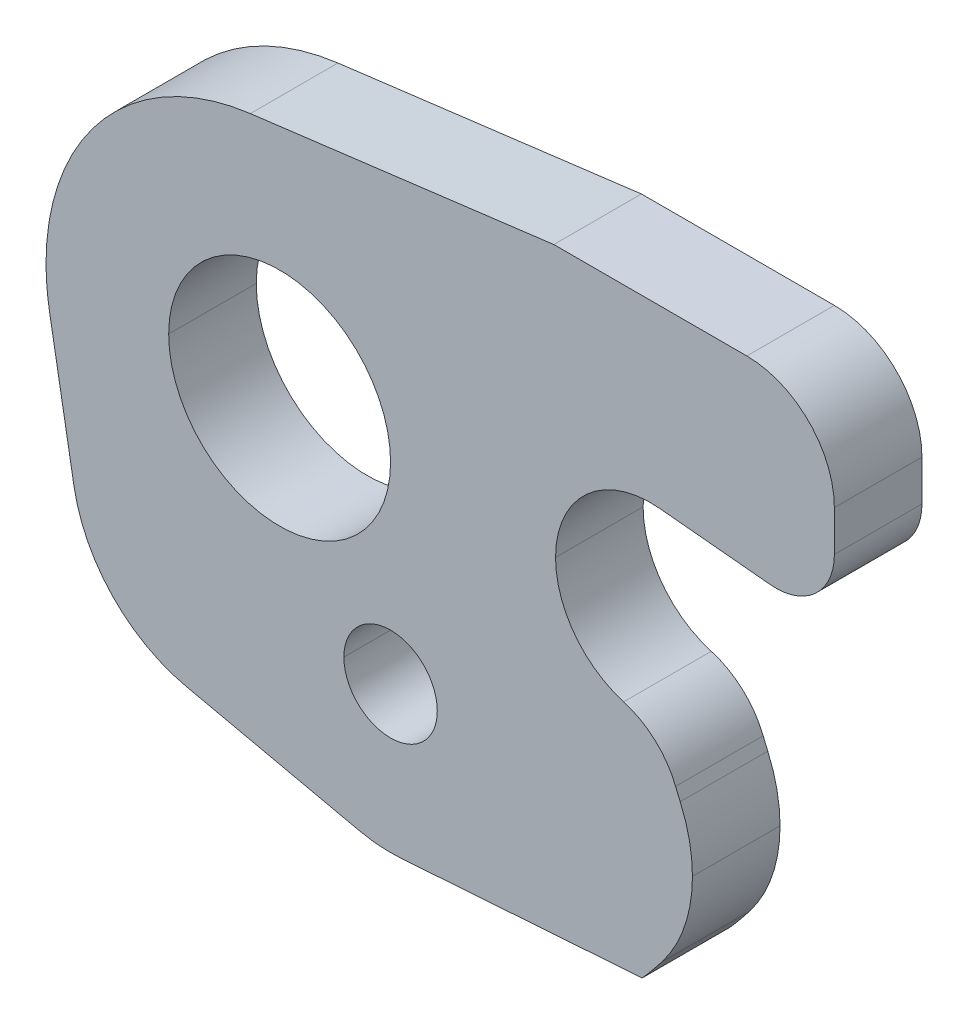
ISO-10303-21;
HEADER;
FILE_DESCRIPTION(('STEP AP214'),'2;1');
FILE_NAME('part.step','',(''),(''),'','','');
FILE_SCHEMA(('AUTOMOTIVE_DESIGN { 1 0 10303 214 1 1 1 1 }'));
ENDSEC;
DATA;
#1=APPLICATION_CONTEXT('core data for automotive mechanical design processes');
#2=APPLICATION_PROTOCOL_DEFINITION('international standard','automotive_design',2000,#1);
#3=PRODUCT_CONTEXT('',#1,'mechanical');
#4=PRODUCT('Part','Part','',(#3));
#5=PRODUCT_RELATED_PRODUCT_CATEGORY('part','',(#4));
#6=PRODUCT_DEFINITION_FORMATION('','',#4);
#7=PRODUCT_DEFINITION_CONTEXT('part definition',#1,'design');
#8=PRODUCT_DEFINITION('design','',#6,#7);
#9=PRODUCT_DEFINITION_SHAPE('','',#8);
#10=(LENGTH_UNIT() NAMED_UNIT(*) SI_UNIT(.MILLI.,.METRE.));
#11=(NAMED_UNIT(*) PLANE_ANGLE_UNIT() SI_UNIT($,.RADIAN.));
#12=(NAMED_UNIT(*) SI_UNIT($,.STERADIAN.) SOLID_ANGLE_UNIT());
#13=UNCERTAINTY_MEASURE_WITH_UNIT(LENGTH_MEASURE(1.E-05),#10,'distance_accuracy_value','');
#14=(GEOMETRIC_REPRESENTATION_CONTEXT(3) GLOBAL_UNCERTAINTY_ASSIGNED_CONTEXT((#13)) GLOBAL_UNIT_ASSIGNED_CONTEXT((#10,
#11,#12)) REPRESENTATION_CONTEXT('',''));
#15=CARTESIAN_POINT('',(0.,0.,0.));
#16=DIRECTION('',(0.,0.,1.));
#17=DIRECTION('',(1.,0.,0.));
#18=AXIS2_PLACEMENT_3D('',#15,#16,#17);
#19=CARTESIAN_POINT('',(-3.56093370082958,-7.1164973952939,-4.));
#20=DIRECTION('',(0.,0.,1.));
#21=DIRECTION('',(1.,0.,0.));
#22=AXIS2_PLACEMENT_3D('',#19,#20,#21);
#23=CYLINDRICAL_SURFACE('',#22,5.);
#24=CARTESIAN_POINT('',(-3.56093370082958,-7.1164973952939,-7.));
#25=DIRECTION('',(0.,0.,-1.));
#26=DIRECTION('',(1.,0.,0.));
#27=AXIS2_PLACEMENT_3D('',#24,#25,#26);
#28=CIRCLE('',#27,5.);
#29=CARTESIAN_POINT('',(1.43906629917042,-7.1164973952939,-7.));
#30=VERTEX_POINT('',#29);
#31=CARTESIAN_POINT('',(0.38408319641119,-10.1884416787217,-7.));
#32=VERTEX_POINT('',#31);
#33=EDGE_CURVE('E42',#30,#32,#28,.T.);
#34=ORIENTED_EDGE('',*,*,#33,.F.);
#35=DIRECTION('',(0.,0.,1.));
#36=VECTOR('',#35,1.);
#37=CARTESIAN_POINT('',(1.43906629917042,-7.1164973952939,-4.));
#38=LINE('',#37,#36);
#39=CARTESIAN_POINT('',(1.43906629917042,-7.1164973952939,-4.));
#40=VERTEX_POINT('',#39);
#41=EDGE_CURVE('E11',#30,#40,#38,.T.);
#42=ORIENTED_EDGE('',*,*,#41,.T.);
#43=CARTESIAN_POINT('',(-3.56093370082958,-7.1164973952939,-4.));
#44=DIRECTION('',(0.,0.,1.));
#45=DIRECTION('',(1.,0.,0.));
#46=AXIS2_PLACEMENT_3D('',#43,#44,#45);
#47=CIRCLE('',#46,5.);
#48=CARTESIAN_POINT('',(0.38408319641119,-10.1884416787217,-4.));
#49=VERTEX_POINT('',#48);
#50=EDGE_CURVE('E258',#49,#40,#47,.T.);
#51=ORIENTED_EDGE('',*,*,#50,.F.);
#52=DIRECTION('',(0.,0.,1.));
#53=VECTOR('',#52,1.);
#54=CARTESIAN_POINT('',(0.384083196411191,-10.1884416787217,-4.));
#55=LINE('',#54,#53);
#56=EDGE_CURVE('E421',#32,#49,#55,.T.);
#57=ORIENTED_EDGE('',*,*,#56,.F.);
#58=EDGE_LOOP('',(#34,#42,#51,#57));
#59=FACE_BOUND('',#58,.T.);
#60=ADVANCED_FACE('F17',(#59),#23,.T.);
#61=CARTESIAN_POINT('',(-12.7,0.,-4.));
#62=DIRECTION('',(0.,0.,-1.));
#63=DIRECTION('',(-1.,0.,0.));
#64=AXIS2_PLACEMENT_3D('',#61,#62,#63);
#65=CYLINDRICAL_SURFACE('',#64,3.8);
#66=CARTESIAN_POINT('',(-12.7,0.,-4.));
#67=DIRECTION('',(0.,0.,1.));
#68=DIRECTION('',(1.,0.,0.));
#69=AXIS2_PLACEMENT_3D('',#66,#67,#68);
#70=CIRCLE('',#69,3.8);
#71=CARTESIAN_POINT('',(-16.5,0.,-4.));
#72=VERTEX_POINT('',#71);
#73=CARTESIAN_POINT('',(-8.9,0.,-4.));
#74=VERTEX_POINT('',#73);
#75=EDGE_CURVE('E28',#72,#74,#70,.T.);
#76=ORIENTED_EDGE('',*,*,#75,.T.);
#77=DIRECTION('',(0.,0.,-1.));
#78=VECTOR('',#77,1.);
#79=CARTESIAN_POINT('',(-8.9,0.,-4.));
#80=LINE('',#79,#78);
#81=CARTESIAN_POINT('',(-8.9,0.,-7.));
#82=VERTEX_POINT('',#81);
#83=EDGE_CURVE('E277',#74,#82,#80,.T.);
#84=ORIENTED_EDGE('',*,*,#83,.T.);
#85=CARTESIAN_POINT('',(-12.7,0.,-7.));
#86=DIRECTION('',(0.,0.,1.));
#87=DIRECTION('',(1.,0.,0.));
#88=AXIS2_PLACEMENT_3D('',#85,#86,#87);
#89=CIRCLE('',#88,3.8);
#90=CARTESIAN_POINT('',(-16.5,0.,-7.));
#91=VERTEX_POINT('',#90);
#92=EDGE_CURVE('E237',#91,#82,#89,.T.);
#93=ORIENTED_EDGE('',*,*,#92,.F.);
#94=DIRECTION('',(0.,0.,-1.));
#95=VECTOR('',#94,1.);
#96=CARTESIAN_POINT('',(-16.5,0.,-4.));
#97=LINE('',#96,#95);
#98=EDGE_CURVE('E333',#72,#91,#97,.T.);
#99=ORIENTED_EDGE('',*,*,#98,.F.);
#100=EDGE_LOOP('',(#76,#84,#93,#99));
#101=FACE_BOUND('',#100,.T.);
#102=ADVANCED_FACE('F896',(#101),#65,.F.);
#103=CARTESIAN_POINT('',(-8.9,-6.58179306876173,-4.));
#104=DIRECTION('',(0.,0.,-1.));
#105=DIRECTION('',(-1.,0.,0.));
#106=AXIS2_PLACEMENT_3D('',#103,#104,#105);
#107=CYLINDRICAL_SURFACE('',#106,1.6);
#108=CARTESIAN_POINT('',(-8.9,-6.58179306876173,-4.));
#109=DIRECTION('',(0.,0.,-1.));
#110=DIRECTION('',(-1.,0.,0.));
#111=AXIS2_PLACEMENT_3D('',#108,#109,#110);
#112=CIRCLE('',#111,1.6);
#113=CARTESIAN_POINT('',(-7.3,-6.58179306876173,-4.));
#114=VERTEX_POINT('',#113);
#115=CARTESIAN_POINT('',(-10.5,-6.58179306876173,-4.));
#116=VERTEX_POINT('',#115);
#117=EDGE_CURVE('E385',#114,#116,#112,.T.);
#118=ORIENTED_EDGE('',*,*,#117,.F.);
#119=DIRECTION('',(0.,0.,-1.));
#120=VECTOR('',#119,1.);
#121=CARTESIAN_POINT('',(-7.3,-6.58179306876173,-4.));
#122=LINE('',#121,#120);
#123=CARTESIAN_POINT('',(-7.3,-6.58179306876173,-7.));
#124=VERTEX_POINT('',#123);
#125=EDGE_CURVE('E302',#114,#124,#122,.T.);
#126=ORIENTED_EDGE('',*,*,#125,.T.);
#127=CARTESIAN_POINT('',(-8.9,-6.58179306876173,-7.));
#128=DIRECTION('',(0.,0.,-1.));
#129=DIRECTION('',(-1.,0.,0.));
#130=AXIS2_PLACEMENT_3D('',#127,#128,#129);
#131=CIRCLE('',#130,1.6);
#132=CARTESIAN_POINT('',(-10.5,-6.58179306876173,-7.));
#133=VERTEX_POINT('',#132);
#134=EDGE_CURVE('E298',#124,#133,#131,.T.);
#135=ORIENTED_EDGE('',*,*,#134,.T.);
#136=DIRECTION('',(0.,0.,-1.));
#137=VECTOR('',#136,1.);
#138=CARTESIAN_POINT('',(-10.5,-6.58179306876173,-4.));
#139=LINE('',#138,#137);
#140=EDGE_CURVE('E247',#116,#133,#139,.T.);
#141=ORIENTED_EDGE('',*,*,#140,.F.);
#142=EDGE_LOOP('',(#118,#126,#135,#141));
#143=FACE_BOUND('',#142,.T.);
#144=ADVANCED_FACE('F891',(#143),#107,.F.);
#145=CARTESIAN_POINT('',(-12.7,0.,-4.));
#146=DIRECTION('',(0.,0.,-1.));
#147=DIRECTION('',(-1.,0.,0.));
#148=AXIS2_PLACEMENT_3D('',#145,#146,#147);
#149=CYLINDRICAL_SURFACE('',#148,8.);
#150=CARTESIAN_POINT('',(-12.7,0.,-4.));
#151=DIRECTION('',(0.,0.,1.));
#152=DIRECTION('',(1.,0.,0.));
#153=AXIS2_PLACEMENT_3D('',#150,#151,#152);
#154=CIRCLE('',#153,8.);
#155=CARTESIAN_POINT('',(-20.7,0.,-4.));
#156=VERTEX_POINT('',#155);
#157=CARTESIAN_POINT('',(-20.5784620240977,-1.38918542133544,-4.));
#158=VERTEX_POINT('',#157);
#159=EDGE_CURVE('E214',#156,#158,#154,.T.);
#160=ORIENTED_EDGE('',*,*,#159,.F.);
#161=DIRECTION('',(0.,0.,-1.));
#162=VECTOR('',#161,1.);
#163=CARTESIAN_POINT('',(-20.7,0.,-4.));
#164=LINE('',#163,#162);
#165=CARTESIAN_POINT('',(-20.7,0.,-7.));
#166=VERTEX_POINT('',#165);
#167=EDGE_CURVE('E303',#156,#166,#164,.T.);
#168=ORIENTED_EDGE('',*,*,#167,.T.);
#169=CARTESIAN_POINT('',(-12.7,0.,-7.));
#170=DIRECTION('',(0.,0.,1.));
#171=DIRECTION('',(1.,0.,0.));
#172=AXIS2_PLACEMENT_3D('',#169,#170,#171);
#173=CIRCLE('',#172,8.);
#174=CARTESIAN_POINT('',(-20.5784620240977,-1.38918542133544,-7.));
#175=VERTEX_POINT('',#174);
#176=EDGE_CURVE('E293',#166,#175,#173,.T.);
#177=ORIENTED_EDGE('',*,*,#176,.T.);
#178=DIRECTION('',(0.,0.,-1.));
#179=VECTOR('',#178,1.);
#180=CARTESIAN_POINT('',(-20.5784620240977,-1.38918542133544,-4.));
#181=LINE('',#180,#179);
#182=EDGE_CURVE('E218',#158,#175,#181,.T.);
#183=ORIENTED_EDGE('',*,*,#182,.F.);
#184=EDGE_LOOP('',(#160,#168,#177,#183));
#185=FACE_BOUND('',#184,.T.);
#186=ADVANCED_FACE('F506',(#185),#149,.T.);
#187=CARTESIAN_POINT('',(0.,0.,-4.));
#188=DIRECTION('',(0.,0.,-1.));
#189=DIRECTION('',(-1.,0.,0.));
#190=AXIS2_PLACEMENT_3D('',#187,#188,#189);
#191=CYLINDRICAL_SURFACE('',#190,3.25);
#192=CARTESIAN_POINT('',(0.,0.,-4.));
#193=DIRECTION('',(0.,0.,-1.));
#194=DIRECTION('',(1.,0.,0.));
#195=AXIS2_PLACEMENT_3D('',#192,#193,#194);
#196=CIRCLE('',#195,3.25);
#197=CARTESIAN_POINT('',(-3.25,0.,-4.));
#198=VERTEX_POINT('',#197);
#199=CARTESIAN_POINT('',(0.31149869569072,3.23503764469334,-4.));
#200=VERTEX_POINT('',#199);
#201=EDGE_CURVE('E379',#198,#200,#196,.T.);
#202=ORIENTED_EDGE('',*,*,#201,.F.);
#203=DIRECTION('',(0.,0.,-1.));
#204=VECTOR('',#203,1.);
#205=CARTESIAN_POINT('',(-3.25,0.,-4.));
#206=LINE('',#205,#204);
#207=CARTESIAN_POINT('',(-3.25,0.,-7.));
#208=VERTEX_POINT('',#207);
#209=EDGE_CURVE('E289',#198,#208,#206,.T.);
#210=ORIENTED_EDGE('',*,*,#209,.T.);
#211=CARTESIAN_POINT('',(0.,0.,-7.));
#212=DIRECTION('',(0.,0.,-1.));
#213=DIRECTION('',(1.,0.,0.));
#214=AXIS2_PLACEMENT_3D('',#211,#212,#213);
#215=CIRCLE('',#214,3.25);
#216=CARTESIAN_POINT('',(0.31149869569072,3.23503764469334,-7.));
#217=VERTEX_POINT('',#216);
#218=EDGE_CURVE('E294',#208,#217,#215,.T.);
#219=ORIENTED_EDGE('',*,*,#218,.T.);
#220=DIRECTION('',(0.,0.,-1.));
#221=VECTOR('',#220,1.);
#222=CARTESIAN_POINT('',(0.31149869569072,3.23503764469334,-4.));
#223=LINE('',#222,#221);
#224=EDGE_CURVE('E311',#200,#217,#223,.T.);
#225=ORIENTED_EDGE('',*,*,#224,.F.);
#226=EDGE_LOOP('',(#202,#210,#219,#225));
#227=FACE_BOUND('',#226,.T.);
#228=ADVANCED_FACE('F521',(#227),#191,.F.);
#229=CARTESIAN_POINT('',(-19.6504258269461,-9.32134344670185,-4.));
#230=DIRECTION('',(0.216439613938103,0.976296007119933,0.));
#231=DIRECTION('',(0.,0.,-1.));
#232=AXIS2_PLACEMENT_3D('',#229,#230,#231);
#233=PLANE('',#232);
#234=DIRECTION('',(0.976296007119934,-0.216439613938103,0.));
#235=VECTOR('',#234,1.);
#236=CARTESIAN_POINT('',(-19.6504258269461,-9.32134344670185,-4.));
#237=LINE('',#236,#235);
#238=CARTESIAN_POINT('',(-15.8989626856317,-10.153022802233,-4.));
#239=VERTEX_POINT('',#238);
#240=CARTESIAN_POINT('',(-9.98250760235053,-11.4646693159631,-4.));
#241=VERTEX_POINT('',#240);
#242=EDGE_CURVE('E328',#239,#241,#237,.T.);
#243=ORIENTED_EDGE('',*,*,#242,.F.);
#244=DIRECTION('',(0.,0.,-1.));
#245=VECTOR('',#244,1.);
#246=CARTESIAN_POINT('',(-15.8989626856317,-10.153022802233,-4.));
#247=LINE('',#246,#245);
#248=CARTESIAN_POINT('',(-15.8989626856317,-10.153022802233,-7.));
#249=VERTEX_POINT('',#248);
#250=EDGE_CURVE('E307',#239,#249,#247,.T.);
#251=ORIENTED_EDGE('',*,*,#250,.T.);
#252=DIRECTION('',(0.976296007119934,-0.216439613938103,0.));
#253=VECTOR('',#252,1.);
#254=CARTESIAN_POINT('',(-19.6504258269461,-9.32134344670185,-7.));
#255=LINE('',#254,#253);
#256=CARTESIAN_POINT('',(-9.98250760235053,-11.4646693159631,-7.));
#257=VERTEX_POINT('',#256);
#258=EDGE_CURVE('E397',#249,#257,#255,.T.);
#259=ORIENTED_EDGE('',*,*,#258,.T.);
#260=DIRECTION('',(0.,0.,-1.));
#261=VECTOR('',#260,1.);
#262=CARTESIAN_POINT('',(-9.98250760235053,-11.4646693159631,-4.));
#263=LINE('',#262,#261);
#264=EDGE_CURVE('E272',#241,#257,#263,.T.);
#265=ORIENTED_EDGE('',*,*,#264,.F.);
#266=EDGE_LOOP('',(#243,#251,#259,#265));
#267=FACE_BOUND('',#266,.T.);
#268=ADVANCED_FACE('F781',(#267),#233,.F.);
#269=CARTESIAN_POINT('',(-8.9,-6.58179306876173,-4.));
#270=DIRECTION('',(0.,0.,-1.));
#271=DIRECTION('',(-1.,0.,0.));
#272=AXIS2_PLACEMENT_3D('',#269,#270,#271);
#273=CYLINDRICAL_SURFACE('',#272,5.00143011094306);
#274=CARTESIAN_POINT('',(-8.9,-6.58179306876173,-7.));
#275=DIRECTION('',(0.,0.,1.));
#276=DIRECTION('',(1.,0.,0.));
#277=AXIS2_PLACEMENT_3D('',#274,#275,#276);
#278=CIRCLE('',#277,5.00143011094306);
#279=CARTESIAN_POINT('',(-8.55111787178275,-11.5710399473255,-7.));
#280=VERTEX_POINT('',#279);
#281=EDGE_CURVE('E288',#257,#280,#278,.T.);
#282=ORIENTED_EDGE('',*,*,#281,.T.);
#283=DIRECTION('',(0.,0.,-1.));
#284=VECTOR('',#283,1.);
#285=CARTESIAN_POINT('',(-8.55111787178275,-11.5710399473255,-4.));
#286=LINE('',#285,#284);
#287=CARTESIAN_POINT('',(-8.55111787178275,-11.5710399473255,-4.));
#288=VERTEX_POINT('',#287);
#289=EDGE_CURVE('E273',#288,#280,#286,.T.);
#290=ORIENTED_EDGE('',*,*,#289,.F.);
#291=CARTESIAN_POINT('',(-8.9,-6.58179306876173,-4.));
#292=DIRECTION('',(0.,0.,1.));
#293=DIRECTION('',(1.,0.,0.));
#294=AXIS2_PLACEMENT_3D('',#291,#292,#293);
#295=CIRCLE('',#294,5.00143011094306);
#296=EDGE_CURVE('E418',#241,#288,#295,.T.);
#297=ORIENTED_EDGE('',*,*,#296,.F.);
#298=ORIENTED_EDGE('',*,*,#264,.T.);
#299=EDGE_LOOP('',(#282,#290,#297,#298));
#300=FACE_BOUND('',#299,.T.);
#301=ADVANCED_FACE('F448',(#300),#273,.T.);
#302=CARTESIAN_POINT('',(-8.55111787178291,-11.5710399473255,-4.));
#303=DIRECTION('',(-0.0697564737441258,0.997564050259824,0.));
#304=DIRECTION('',(0.,0.,1.));
#305=AXIS2_PLACEMENT_3D('',#302,#303,#304);
#306=PLANE('',#305);
#307=DIRECTION('',(0.997564050259824,0.0697564737441258,0.));
#308=VECTOR('',#307,1.);
#309=CARTESIAN_POINT('',(-8.55111787178291,-11.5710399473255,-7.));
#310=LINE('',#309,#308);
#311=CARTESIAN_POINT('',(-0.28418705475944,-10.9929598307335,-7.));
#312=VERTEX_POINT('',#311);
#313=EDGE_CURVE('E268',#280,#312,#310,.T.);
#314=ORIENTED_EDGE('',*,*,#313,.T.);
#315=DIRECTION('',(0.,0.,-1.));
#316=VECTOR('',#315,1.);
#317=CARTESIAN_POINT('',(-0.28418705475944,-10.9929598307335,-4.));
#318=LINE('',#317,#316);
#319=CARTESIAN_POINT('',(-0.28418705475944,-10.9929598307335,-4.));
#320=VERTEX_POINT('',#319);
#321=EDGE_CURVE('E21',#320,#312,#318,.T.);
#322=ORIENTED_EDGE('',*,*,#321,.F.);
#323=DIRECTION('',(0.997564050259824,0.0697564737441258,0.));
#324=VECTOR('',#323,1.);
#325=CARTESIAN_POINT('',(-8.55111787178291,-11.5710399473255,-4.));
#326=LINE('',#325,#324);
#327=EDGE_CURVE('E257',#288,#320,#326,.T.);
#328=ORIENTED_EDGE('',*,*,#327,.F.);
#329=ORIENTED_EDGE('',*,*,#289,.T.);
#330=EDGE_LOOP('',(#314,#322,#328,#329));
#331=FACE_BOUND('',#330,.T.);
#332=ADVANCED_FACE('F459',(#331),#306,.F.);
#333=CARTESIAN_POINT('',(-12.7,0.,-4.));
#334=DIRECTION('',(0.,0.,-1.));
#335=DIRECTION('',(-1.,0.,0.));
#336=AXIS2_PLACEMENT_3D('',#333,#334,#335);
#337=CYLINDRICAL_SURFACE('',#336,16.5830508933466);
#338=CARTESIAN_POINT('',(-12.7,0.,-7.));
#339=DIRECTION('',(0.,0.,1.));
#340=DIRECTION('',(1.,0.,0.));
#341=AXIS2_PLACEMENT_3D('',#338,#339,#340);
#342=CIRCLE('',#341,16.5830508933466);
#343=EDGE_CURVE('E321',#312,#32,#342,.T.);
#344=ORIENTED_EDGE('',*,*,#343,.T.);
#345=ORIENTED_EDGE('',*,*,#56,.T.);
#346=CARTESIAN_POINT('',(-12.7,0.,-4.));
#347=DIRECTION('',(0.,0.,1.));
#348=DIRECTION('',(1.,0.,0.));
#349=AXIS2_PLACEMENT_3D('',#346,#347,#348);
#350=CIRCLE('',#349,16.5830508933466);
#351=EDGE_CURVE('E253',#320,#49,#350,.T.);
#352=ORIENTED_EDGE('',*,*,#351,.F.);
#353=ORIENTED_EDGE('',*,*,#321,.T.);
#354=EDGE_LOOP('',(#344,#345,#352,#353));
#355=FACE_BOUND('',#354,.T.);
#356=ADVANCED_FACE('F810',(#355),#337,.T.);
#357=CARTESIAN_POINT('',(12.7,0.,-4.));
#358=DIRECTION('',(0.,0.,-1.));
#359=DIRECTION('',(-1.,0.,0.));
#360=AXIS2_PLACEMENT_3D('',#357,#358,#359);
#361=CYLINDRICAL_SURFACE('',#360,12.75);
#362=CARTESIAN_POINT('',(12.7,0.,-4.));
#363=DIRECTION('',(0.,0.,-1.));
#364=DIRECTION('',(1.,0.,0.));
#365=AXIS2_PLACEMENT_3D('',#362,#363,#364);
#366=CIRCLE('',#365,12.75);
#367=CARTESIAN_POINT('',(1.01961100362946,-5.11185024168999,-4.));
#368=VERTEX_POINT('',#367);
#369=CARTESIAN_POINT('',(0.861964628213943,-4.73533721463981,-4.));
#370=VERTEX_POINT('',#369);
#371=EDGE_CURVE('E220',#368,#370,#366,.T.);
#372=ORIENTED_EDGE('',*,*,#371,.F.);
#373=DIRECTION('',(0.,0.,-1.));
#374=VECTOR('',#373,1.);
#375=CARTESIAN_POINT('',(1.01961100362946,-5.11185024168999,-4.));
#376=LINE('',#375,#374);
#377=CARTESIAN_POINT('',(1.01961100362946,-5.11185024168999,-7.));
#378=VERTEX_POINT('',#377);
#379=EDGE_CURVE('E437',#368,#378,#376,.T.);
#380=ORIENTED_EDGE('',*,*,#379,.T.);
#381=CARTESIAN_POINT('',(12.7,0.,-7.));
#382=DIRECTION('',(0.,0.,-1.));
#383=DIRECTION('',(1.,0.,0.));
#384=AXIS2_PLACEMENT_3D('',#381,#382,#383);
#385=CIRCLE('',#384,12.75);
#386=CARTESIAN_POINT('',(0.861964628213943,-4.73533721463981,-7.));
#387=VERTEX_POINT('',#386);
#388=EDGE_CURVE('E242',#378,#387,#385,.T.);
#389=ORIENTED_EDGE('',*,*,#388,.T.);
#390=DIRECTION('',(0.,0.,-1.));
#391=VECTOR('',#390,1.);
#392=CARTESIAN_POINT('',(0.861964628213943,-4.73533721463981,-4.));
#393=LINE('',#392,#391);
#394=EDGE_CURVE('E243',#370,#387,#393,.T.);
#395=ORIENTED_EDGE('',*,*,#394,.F.);
#396=EDGE_LOOP('',(#372,#380,#389,#395));
#397=FACE_BOUND('',#396,.T.);
#398=ADVANCED_FACE('F882',(#397),#361,.F.);
#399=CARTESIAN_POINT('',(-1.69133858267716,-5.75668079701729,-4.));
#400=DIRECTION('',(0.,0.,-1.));
#401=DIRECTION('',(-1.,0.,0.));
#402=AXIS2_PLACEMENT_3D('',#399,#400,#401);
#403=CYLINDRICAL_SURFACE('',#402,2.75);
#404=CARTESIAN_POINT('',(-1.69133858267716,-5.75668079701729,-7.));
#405=DIRECTION('',(0.,0.,1.));
#406=DIRECTION('',(1.,0.,0.));
#407=AXIS2_PLACEMENT_3D('',#404,#405,#406);
#408=CIRCLE('',#407,2.75);
#409=CARTESIAN_POINT('',(-0.916141732283465,-3.11820209838436,-7.));
#410=VERTEX_POINT('',#409);
#411=EDGE_CURVE('E238',#387,#410,#408,.T.);
#412=ORIENTED_EDGE('',*,*,#411,.T.);
#413=DIRECTION('',(0.,0.,-1.));
#414=VECTOR('',#413,1.);
#415=CARTESIAN_POINT('',(-0.916141732283465,-3.11820209838436,-4.));
#416=LINE('',#415,#414);
#417=CARTESIAN_POINT('',(-0.916141732283465,-3.11820209838436,-4.));
#418=VERTEX_POINT('',#417);
#419=EDGE_CURVE('E264',#418,#410,#416,.T.);
#420=ORIENTED_EDGE('',*,*,#419,.F.);
#421=CARTESIAN_POINT('',(-1.69133858267716,-5.75668079701729,-4.));
#422=DIRECTION('',(0.,0.,1.));
#423=DIRECTION('',(1.,0.,0.));
#424=AXIS2_PLACEMENT_3D('',#421,#422,#423);
#425=CIRCLE('',#424,2.75);
#426=EDGE_CURVE('E225',#370,#418,#425,.T.);
#427=ORIENTED_EDGE('',*,*,#426,.F.);
#428=ORIENTED_EDGE('',*,*,#394,.T.);
#429=EDGE_LOOP('',(#412,#420,#427,#428));
#430=FACE_BOUND('',#429,.T.);
#431=ADVANCED_FACE('F876',(#430),#403,.T.);
#432=CARTESIAN_POINT('',(0.,0.,-4.));
#433=DIRECTION('',(0.,0.,-1.));
#434=DIRECTION('',(-1.,0.,0.));
#435=AXIS2_PLACEMENT_3D('',#432,#433,#434);
#436=CYLINDRICAL_SURFACE('',#435,3.25);
#437=ORIENTED_EDGE('',*,*,#209,.F.);
#438=CARTESIAN_POINT('',(0.,0.,-4.));
#439=DIRECTION('',(0.,0.,-1.));
#440=DIRECTION('',(1.,0.,0.));
#441=AXIS2_PLACEMENT_3D('',#438,#439,#440);
#442=CIRCLE('',#441,3.25);
#443=EDGE_CURVE('E285',#418,#198,#442,.T.);
#444=ORIENTED_EDGE('',*,*,#443,.F.);
#445=ORIENTED_EDGE('',*,*,#419,.T.);
#446=CARTESIAN_POINT('',(0.,0.,-7.));
#447=DIRECTION('',(0.,0.,-1.));
#448=DIRECTION('',(1.,0.,0.));
#449=AXIS2_PLACEMENT_3D('',#446,#447,#448);
#450=CIRCLE('',#449,3.25);
#451=EDGE_CURVE('E376',#410,#208,#450,.T.);
#452=ORIENTED_EDGE('',*,*,#451,.T.);
#453=EDGE_LOOP('',(#437,#444,#445,#452));
#454=FACE_BOUND('',#453,.T.);
#455=ADVANCED_FACE('F881',(#454),#436,.F.);
#456=CARTESIAN_POINT('',(0.31149869569072,3.23503764469334,-4.));
#457=DIRECTION('',(0.0958457525202244,0.995396198367179,0.));
#458=DIRECTION('',(0.,0.,-1.));
#459=AXIS2_PLACEMENT_3D('',#456,#457,#458);
#460=PLANE('',#459);
#461=DIRECTION('',(0.995396198367179,-0.0958457525202244,0.));
#462=VECTOR('',#461,1.);
#463=CARTESIAN_POINT('',(0.31149869569072,3.23503764469334,-7.));
#464=LINE('',#463,#462);
#465=CARTESIAN_POINT('',(4.10830849495955,2.86944644293465,-7.));
#466=VERTEX_POINT('',#465);
#467=EDGE_CURVE('E314',#217,#466,#464,.T.);
#468=ORIENTED_EDGE('',*,*,#467,.T.);
#469=DIRECTION('',(0.,0.,-1.));
#470=VECTOR('',#469,1.);
#471=CARTESIAN_POINT('',(4.10830849495955,2.86944644293465,-4.));
#472=LINE('',#471,#470);
#473=CARTESIAN_POINT('',(4.10830849495955,2.86944644293465,-4.));
#474=VERTEX_POINT('',#473);
#475=EDGE_CURVE('E403',#474,#466,#472,.T.);
#476=ORIENTED_EDGE('',*,*,#475,.F.);
#477=DIRECTION('',(0.995396198367179,-0.0958457525202244,0.));
#478=VECTOR('',#477,1.);
#479=CARTESIAN_POINT('',(0.31149869569072,3.23503764469334,-4.));
#480=LINE('',#479,#478);
#481=EDGE_CURVE('E246',#200,#474,#480,.T.);
#482=ORIENTED_EDGE('',*,*,#481,.F.);
#483=ORIENTED_EDGE('',*,*,#224,.T.);
#484=EDGE_LOOP('',(#468,#476,#482,#483));
#485=FACE_BOUND('',#484,.T.);
#486=ADVANCED_FACE('F519',(#485),#460,.F.);
#487=CARTESIAN_POINT('',(4.3,4.86023883966901,-4.));
#488=DIRECTION('',(0.,0.,-1.));
#489=DIRECTION('',(-1.,0.,0.));
#490=AXIS2_PLACEMENT_3D('',#487,#488,#489);
#491=CYLINDRICAL_SURFACE('',#490,2.);
#492=CARTESIAN_POINT('',(4.3,4.86023883966901,-7.));
#493=DIRECTION('',(0.,0.,1.));
#494=DIRECTION('',(1.,0.,0.));
#495=AXIS2_PLACEMENT_3D('',#492,#493,#494);
#496=CIRCLE('',#495,2.);
#497=CARTESIAN_POINT('',(6.3,4.86023883966901,-7.));
#498=VERTEX_POINT('',#497);
#499=EDGE_CURVE('E315',#466,#498,#496,.T.);
#500=ORIENTED_EDGE('',*,*,#499,.T.);
#501=DIRECTION('',(0.,0.,-1.));
#502=VECTOR('',#501,1.);
#503=CARTESIAN_POINT('',(6.3,4.86023883966901,-4.));
#504=LINE('',#503,#502);
#505=CARTESIAN_POINT('',(6.3,4.86023883966901,-4.));
#506=VERTEX_POINT('',#505);
#507=EDGE_CURVE('E353',#506,#498,#504,.T.);
#508=ORIENTED_EDGE('',*,*,#507,.F.);
#509=CARTESIAN_POINT('',(4.3,4.86023883966901,-4.));
#510=DIRECTION('',(0.,0.,1.));
#511=DIRECTION('',(1.,0.,0.));
#512=AXIS2_PLACEMENT_3D('',#509,#510,#511);
#513=CIRCLE('',#512,2.);
#514=EDGE_CURVE('E232',#474,#506,#513,.T.);
#515=ORIENTED_EDGE('',*,*,#514,.F.);
#516=ORIENTED_EDGE('',*,*,#475,.T.);
#517=EDGE_LOOP('',(#500,#508,#515,#516));
#518=FACE_BOUND('',#517,.T.);
#519=ADVANCED_FACE('F512',(#518),#491,.T.);
#520=CARTESIAN_POINT('',(6.3,4.86023883966901,-4.));
#521=DIRECTION('',(-1.,0.,0.));
#522=DIRECTION('',(0.,0.,1.));
#523=AXIS2_PLACEMENT_3D('',#520,#521,#522);
#524=PLANE('',#523);
#525=DIRECTION('',(0.,1.,0.));
#526=VECTOR('',#525,1.);
#527=CARTESIAN_POINT('',(6.3,4.86023883966901,-7.));
#528=LINE('',#527,#526);
#529=CARTESIAN_POINT('',(6.3,6.25,-7.));
#530=VERTEX_POINT('',#529);
#531=EDGE_CURVE('E360',#498,#530,#528,.T.);
#532=ORIENTED_EDGE('',*,*,#531,.T.);
#533=DIRECTION('',(0.,0.,-1.));
#534=VECTOR('',#533,1.);
#535=CARTESIAN_POINT('',(6.3,6.25,-4.));
#536=LINE('',#535,#534);
#537=CARTESIAN_POINT('',(6.3,6.25,-4.));
#538=VERTEX_POINT('',#537);
#539=EDGE_CURVE('E318',#538,#530,#536,.T.);
#540=ORIENTED_EDGE('',*,*,#539,.F.);
#541=DIRECTION('',(0.,1.,0.));
#542=VECTOR('',#541,1.);
#543=CARTESIAN_POINT('',(6.3,4.86023883966901,-4.));
#544=LINE('',#543,#542);
#545=EDGE_CURVE('E229',#506,#538,#544,.T.);
#546=ORIENTED_EDGE('',*,*,#545,.F.);
#547=ORIENTED_EDGE('',*,*,#507,.T.);
#548=EDGE_LOOP('',(#532,#540,#546,#547));
#549=FACE_BOUND('',#548,.T.);
#550=ADVANCED_FACE('F514',(#549),#524,.F.);
#551=CARTESIAN_POINT('',(3.3,6.25,-4.));
#552=DIRECTION('',(0.,0.,-1.));
#553=DIRECTION('',(-1.,0.,0.));
#554=AXIS2_PLACEMENT_3D('',#551,#552,#553);
#555=CYLINDRICAL_SURFACE('',#554,3.);
#556=CARTESIAN_POINT('',(3.3,6.25,-7.));
#557=DIRECTION('',(0.,0.,1.));
#558=DIRECTION('',(1.,0.,0.));
#559=AXIS2_PLACEMENT_3D('',#556,#557,#558);
#560=CIRCLE('',#559,3.);
#561=CARTESIAN_POINT('',(3.3,9.25,-7.));
#562=VERTEX_POINT('',#561);
#563=EDGE_CURVE('E350',#530,#562,#560,.T.);
#564=ORIENTED_EDGE('',*,*,#563,.T.);
#565=DIRECTION('',(0.,0.,-1.));
#566=VECTOR('',#565,1.);
#567=CARTESIAN_POINT('',(3.3,9.25,-4.));
#568=LINE('',#567,#566);
#569=CARTESIAN_POINT('',(3.3,9.25,-4.));
#570=VERTEX_POINT('',#569);
#571=EDGE_CURVE('E226',#570,#562,#568,.T.);
#572=ORIENTED_EDGE('',*,*,#571,.F.);
#573=CARTESIAN_POINT('',(3.3,6.25,-4.));
#574=DIRECTION('',(0.,0.,1.));
#575=DIRECTION('',(1.,0.,0.));
#576=AXIS2_PLACEMENT_3D('',#573,#574,#575);
#577=CIRCLE('',#576,3.);
#578=EDGE_CURVE('E191',#538,#570,#577,.T.);
#579=ORIENTED_EDGE('',*,*,#578,.F.);
#580=ORIENTED_EDGE('',*,*,#539,.T.);
#581=EDGE_LOOP('',(#564,#572,#579,#580));
#582=FACE_BOUND('',#581,.T.);
#583=ADVANCED_FACE('F769',(#582),#555,.T.);
#584=CARTESIAN_POINT('',(3.3,9.25,-4.));
#585=DIRECTION('',(0.,-1.,0.));
#586=DIRECTION('',(-1.,0.,0.));
#587=AXIS2_PLACEMENT_3D('',#584,#585,#586);
#588=PLANE('',#587);
#589=DIRECTION('',(-1.,0.,0.));
#590=VECTOR('',#589,1.);
#591=CARTESIAN_POINT('',(3.3,9.25,-7.));
#592=LINE('',#591,#590);
#593=CARTESIAN_POINT('',(-3.30854847764693,9.25,-7.));
#594=VERTEX_POINT('',#593);
#595=EDGE_CURVE('E199',#562,#594,#592,.T.);
#596=ORIENTED_EDGE('',*,*,#595,.T.);
#597=DIRECTION('',(0.,0.,-1.));
#598=VECTOR('',#597,1.);
#599=CARTESIAN_POINT('',(-3.30854847764693,9.25,-4.));
#600=LINE('',#599,#598);
#601=CARTESIAN_POINT('',(-3.30854847764693,9.25,-4.));
#602=VERTEX_POINT('',#601);
#603=EDGE_CURVE('E170',#602,#594,#600,.T.);
#604=ORIENTED_EDGE('',*,*,#603,.F.);
#605=DIRECTION('',(-1.,0.,0.));
#606=VECTOR('',#605,1.);
#607=CARTESIAN_POINT('',(3.3,9.25,-4.));
#608=LINE('',#607,#606);
#609=EDGE_CURVE('E182',#570,#602,#608,.T.);
#610=ORIENTED_EDGE('',*,*,#609,.F.);
#611=ORIENTED_EDGE('',*,*,#571,.T.);
#612=EDGE_LOOP('',(#596,#604,#610,#611));
#613=FACE_BOUND('',#612,.T.);
#614=ADVANCED_FACE('F197',(#613),#588,.F.);
#615=CARTESIAN_POINT('',(-3.30854847764693,9.25,-4.));
#616=DIRECTION('',(0.125333233564304,-0.992114701314478,0.));
#617=DIRECTION('',(0.,0.,-1.));
#618=AXIS2_PLACEMENT_3D('',#615,#616,#617);
#619=PLANE('',#618);
#620=DIRECTION('',(-0.992114701314478,-0.125333233564304,0.));
#621=VECTOR('',#620,1.);
#622=CARTESIAN_POINT('',(-3.30854847764693,9.25,-7.));
#623=LINE('',#622,#621);
#624=CARTESIAN_POINT('',(-13.7026658685144,7.93691761051582,-7.));
#625=VERTEX_POINT('',#624);
#626=EDGE_CURVE('E202',#594,#625,#623,.T.);
#627=ORIENTED_EDGE('',*,*,#626,.T.);
#628=DIRECTION('',(0.,0.,-1.));
#629=VECTOR('',#628,1.);
#630=CARTESIAN_POINT('',(-13.7026658685144,7.93691761051582,-4.));
#631=LINE('',#630,#629);
#632=CARTESIAN_POINT('',(-13.7026658685144,7.93691761051582,-4.));
#633=VERTEX_POINT('',#632);
#634=EDGE_CURVE('E203',#633,#625,#631,.T.);
#635=ORIENTED_EDGE('',*,*,#634,.F.);
#636=DIRECTION('',(-0.992114701314478,-0.125333233564304,0.));
#637=VECTOR('',#636,1.);
#638=CARTESIAN_POINT('',(-3.30854847764693,9.25,-4.));
#639=LINE('',#638,#637);
#640=EDGE_CURVE('E187',#602,#633,#639,.T.);
#641=ORIENTED_EDGE('',*,*,#640,.F.);
#642=ORIENTED_EDGE('',*,*,#603,.T.);
#643=EDGE_LOOP('',(#627,#635,#641,#642));
#644=FACE_BOUND('',#643,.T.);
#645=ADVANCED_FACE('F205',(#644),#619,.F.);
#646=CARTESIAN_POINT('',(-12.7,0.,-4.));
#647=DIRECTION('',(0.,0.,-1.));
#648=DIRECTION('',(-1.,0.,0.));
#649=AXIS2_PLACEMENT_3D('',#646,#647,#648);
#650=CYLINDRICAL_SURFACE('',#649,8.);
#651=ORIENTED_EDGE('',*,*,#167,.F.);
#652=CARTESIAN_POINT('',(-12.7,0.,-4.));
#653=DIRECTION('',(0.,0.,1.));
#654=DIRECTION('',(1.,0.,0.));
#655=AXIS2_PLACEMENT_3D('',#652,#653,#654);
#656=CIRCLE('',#655,8.);
#657=EDGE_CURVE('E208',#633,#156,#656,.T.);
#658=ORIENTED_EDGE('',*,*,#657,.F.);
#659=ORIENTED_EDGE('',*,*,#634,.T.);
#660=CARTESIAN_POINT('',(-12.7,0.,-7.));
#661=DIRECTION('',(0.,0.,1.));
#662=DIRECTION('',(1.,0.,0.));
#663=AXIS2_PLACEMENT_3D('',#660,#661,#662);
#664=CIRCLE('',#663,8.);
#665=EDGE_CURVE('E251',#625,#166,#664,.T.);
#666=ORIENTED_EDGE('',*,*,#665,.T.);
#667=EDGE_LOOP('',(#651,#658,#659,#666));
#668=FACE_BOUND('',#667,.T.);
#669=ADVANCED_FACE('F508',(#668),#650,.T.);
#670=CARTESIAN_POINT('',(-8.9,-6.58179306876173,-4.));
#671=DIRECTION('',(0.,0.,-1.));
#672=DIRECTION('',(-1.,0.,0.));
#673=AXIS2_PLACEMENT_3D('',#670,#671,#672);
#674=CYLINDRICAL_SURFACE('',#673,1.6);
#675=ORIENTED_EDGE('',*,*,#125,.F.);
#676=CARTESIAN_POINT('',(-8.9,-6.58179306876173,-4.));
#677=DIRECTION('',(0.,0.,-1.));
#678=DIRECTION('',(-1.,0.,0.));
#679=AXIS2_PLACEMENT_3D('',#676,#677,#678);
#680=CIRCLE('',#679,1.6);
#681=EDGE_CURVE('E430',#116,#114,#680,.T.);
#682=ORIENTED_EDGE('',*,*,#681,.F.);
#683=ORIENTED_EDGE('',*,*,#140,.T.);
#684=CARTESIAN_POINT('',(-8.9,-6.58179306876173,-7.));
#685=DIRECTION('',(0.,0.,-1.));
#686=DIRECTION('',(-1.,0.,0.));
#687=AXIS2_PLACEMENT_3D('',#684,#685,#686);
#688=CIRCLE('',#687,1.6);
#689=EDGE_CURVE('E252',#133,#124,#688,.T.);
#690=ORIENTED_EDGE('',*,*,#689,.T.);
#691=EDGE_LOOP('',(#675,#682,#683,#690));
#692=FACE_BOUND('',#691,.T.);
#693=ADVANCED_FACE('F822',(#692),#674,.F.);
#694=CARTESIAN_POINT('',(-20.5784620240977,-1.38918542133544,-4.));
#695=DIRECTION('',(0.984807753012208,0.17364817766693,0.));
#696=DIRECTION('',(0.,0.,-1.));
#697=AXIS2_PLACEMENT_3D('',#694,#695,#696);
#698=PLANE('',#697);
#699=DIRECTION('',(0.17364817766693,-0.984807753012208,0.));
#700=VECTOR('',#699,1.);
#701=CARTESIAN_POINT('',(-20.5784620240977,-1.38918542133544,-7.));
#702=LINE('',#701,#700);
#703=CARTESIAN_POINT('',(-19.7408033810023,-6.13978365496794,-7.));
#704=VERTEX_POINT('',#703);
#705=EDGE_CURVE('E338',#175,#704,#702,.T.);
#706=ORIENTED_EDGE('',*,*,#705,.T.);
#707=DIRECTION('',(0.,0.,1.));
#708=VECTOR('',#707,1.);
#709=CARTESIAN_POINT('',(-19.7408033810023,-6.13978365496794,-4.));
#710=LINE('',#709,#708);
#711=CARTESIAN_POINT('',(-19.7408033810023,-6.13978365496794,-4.));
#712=VERTEX_POINT('',#711);
#713=EDGE_CURVE('E342',#704,#712,#710,.T.);
#714=ORIENTED_EDGE('',*,*,#713,.T.);
#715=DIRECTION('',(0.17364817766693,-0.984807753012208,0.));
#716=VECTOR('',#715,1.);
#717=CARTESIAN_POINT('',(-20.5784620240977,-1.38918542133544,-4.));
#718=LINE('',#717,#716);
#719=EDGE_CURVE('E327',#158,#712,#718,.T.);
#720=ORIENTED_EDGE('',*,*,#719,.F.);
#721=ORIENTED_EDGE('',*,*,#182,.T.);
#722=EDGE_LOOP('',(#706,#714,#720,#721));
#723=FACE_BOUND('',#722,.T.);
#724=ADVANCED_FACE('F817',(#723),#698,.F.);
#725=CARTESIAN_POINT('',(-12.7,0.,-4.));
#726=DIRECTION('',(0.,0.,-1.));
#727=DIRECTION('',(-1.,0.,0.));
#728=AXIS2_PLACEMENT_3D('',#725,#726,#727);
#729=CYLINDRICAL_SURFACE('',#728,3.8);
#730=ORIENTED_EDGE('',*,*,#83,.F.);
#731=CARTESIAN_POINT('',(-12.7,0.,-4.));
#732=DIRECTION('',(0.,0.,1.));
#733=DIRECTION('',(1.,0.,0.));
#734=AXIS2_PLACEMENT_3D('',#731,#732,#733);
#735=CIRCLE('',#734,3.8);
#736=EDGE_CURVE('E329',#74,#72,#735,.T.);
#737=ORIENTED_EDGE('',*,*,#736,.T.);
#738=ORIENTED_EDGE('',*,*,#98,.T.);
#739=CARTESIAN_POINT('',(-12.7,0.,-7.));
#740=DIRECTION('',(0.,0.,1.));
#741=DIRECTION('',(1.,0.,0.));
#742=AXIS2_PLACEMENT_3D('',#739,#740,#741);
#743=CIRCLE('',#742,3.8);
#744=EDGE_CURVE('E233',#82,#91,#743,.T.);
#745=ORIENTED_EDGE('',*,*,#744,.F.);
#746=EDGE_LOOP('',(#730,#737,#738,#745));
#747=FACE_BOUND('',#746,.T.);
#748=ADVANCED_FACE('F798',(#747),#729,.F.);
#749=CARTESIAN_POINT('',(-18.8928871781628,-5.90430742178208,-4.));
#750=DIRECTION('',(0.,0.,1.));
#751=DIRECTION('',(1.,0.,0.));
#752=AXIS2_PLACEMENT_3D('',#749,#750,#751);
#753=PLANE('',#752);
#754=ORIENTED_EDGE('',*,*,#719,.T.);
#755=CARTESIAN_POINT('',(-14.8167646159412,-5.27154276663329,-4.));
#756=DIRECTION('',(0.,0.,1.));
#757=DIRECTION('',(1.,0.,0.));
#758=AXIS2_PLACEMENT_3D('',#755,#756,#757);
#759=CIRCLE('',#758,5.);
#760=EDGE_CURVE('E323',#712,#239,#759,.T.);
#761=ORIENTED_EDGE('',*,*,#760,.T.);
#762=ORIENTED_EDGE('',*,*,#242,.T.);
#763=ORIENTED_EDGE('',*,*,#296,.T.);
#764=ORIENTED_EDGE('',*,*,#327,.T.);
#765=ORIENTED_EDGE('',*,*,#351,.T.);
#766=ORIENTED_EDGE('',*,*,#50,.T.);
#767=CARTESIAN_POINT('',(-3.56093370082958,-7.1164973952939,-4.));
#768=DIRECTION('',(0.,0.,1.));
#769=DIRECTION('',(1.,0.,0.));
#770=AXIS2_PLACEMENT_3D('',#767,#768,#769);
#771=CIRCLE('',#770,5.);
#772=EDGE_CURVE('E224',#40,#368,#771,.T.);
#773=ORIENTED_EDGE('',*,*,#772,.T.);
#774=ORIENTED_EDGE('',*,*,#371,.T.);
#775=ORIENTED_EDGE('',*,*,#426,.T.);
#776=ORIENTED_EDGE('',*,*,#443,.T.);
#777=ORIENTED_EDGE('',*,*,#201,.T.);
#778=ORIENTED_EDGE('',*,*,#481,.T.);
#779=ORIENTED_EDGE('',*,*,#514,.T.);
#780=ORIENTED_EDGE('',*,*,#545,.T.);
#781=ORIENTED_EDGE('',*,*,#578,.T.);
#782=ORIENTED_EDGE('',*,*,#609,.T.);
#783=ORIENTED_EDGE('',*,*,#640,.T.);
#784=ORIENTED_EDGE('',*,*,#657,.T.);
#785=ORIENTED_EDGE('',*,*,#159,.T.);
#786=EDGE_LOOP('',(#754,#761,#762,#763,#764,#765,#766,#773,#774,#775,#776,#777,#778,#779,#780,
#781,#782,#783,#784,#785));
#787=FACE_BOUND('',#786,.T.);
#788=ORIENTED_EDGE('',*,*,#681,.T.);
#789=ORIENTED_EDGE('',*,*,#117,.T.);
#790=EDGE_LOOP('',(#788,#789));
#791=FACE_BOUND('',#790,.T.);
#792=ORIENTED_EDGE('',*,*,#75,.F.);
#793=ORIENTED_EDGE('',*,*,#736,.F.);
#794=EDGE_LOOP('',(#792,#793));
#795=FACE_BOUND('',#794,.T.);
#796=ADVANCED_FACE('F184',(#787,#791,#795),#753,.T.);
#797=CARTESIAN_POINT('',(-18.8928871781628,-5.90430742178208,-7.));
#798=DIRECTION('',(0.,0.,1.));
#799=DIRECTION('',(1.,0.,0.));
#800=AXIS2_PLACEMENT_3D('',#797,#798,#799);
#801=PLANE('',#800);
#802=ORIENTED_EDGE('',*,*,#258,.F.);
#803=CARTESIAN_POINT('',(-14.8167646159412,-5.27154276663329,-7.));
#804=DIRECTION('',(0.,0.,-1.));
#805=DIRECTION('',(1.,0.,0.));
#806=AXIS2_PLACEMENT_3D('',#803,#804,#805);
#807=CIRCLE('',#806,5.);
#808=EDGE_CURVE('E282',#249,#704,#807,.T.);
#809=ORIENTED_EDGE('',*,*,#808,.T.);
#810=ORIENTED_EDGE('',*,*,#705,.F.);
#811=ORIENTED_EDGE('',*,*,#176,.F.);
#812=ORIENTED_EDGE('',*,*,#665,.F.);
#813=ORIENTED_EDGE('',*,*,#626,.F.);
#814=ORIENTED_EDGE('',*,*,#595,.F.);
#815=ORIENTED_EDGE('',*,*,#563,.F.);
#816=ORIENTED_EDGE('',*,*,#531,.F.);
#817=ORIENTED_EDGE('',*,*,#499,.F.);
#818=ORIENTED_EDGE('',*,*,#467,.F.);
#819=ORIENTED_EDGE('',*,*,#218,.F.);
#820=ORIENTED_EDGE('',*,*,#451,.F.);
#821=ORIENTED_EDGE('',*,*,#411,.F.);
#822=ORIENTED_EDGE('',*,*,#388,.F.);
#823=CARTESIAN_POINT('',(-3.56093370082958,-7.1164973952939,-7.));
#824=DIRECTION('',(0.,0.,-1.));
#825=DIRECTION('',(1.,0.,0.));
#826=AXIS2_PLACEMENT_3D('',#823,#824,#825);
#827=CIRCLE('',#826,5.);
#828=EDGE_CURVE('E278',#378,#30,#827,.T.);
#829=ORIENTED_EDGE('',*,*,#828,.T.);
#830=ORIENTED_EDGE('',*,*,#33,.T.);
#831=ORIENTED_EDGE('',*,*,#343,.F.);
#832=ORIENTED_EDGE('',*,*,#313,.F.);
#833=ORIENTED_EDGE('',*,*,#281,.F.);
#834=EDGE_LOOP('',(#802,#809,#810,#811,#812,#813,#814,#815,#816,#817,#818,#819,#820,#821,#822,
#829,#830,#831,#832,#833));
#835=FACE_BOUND('',#834,.T.);
#836=ORIENTED_EDGE('',*,*,#689,.F.);
#837=ORIENTED_EDGE('',*,*,#134,.F.);
#838=EDGE_LOOP('',(#836,#837));
#839=FACE_BOUND('',#838,.T.);
#840=ORIENTED_EDGE('',*,*,#92,.T.);
#841=ORIENTED_EDGE('',*,*,#744,.T.);
#842=EDGE_LOOP('',(#840,#841));
#843=FACE_BOUND('',#842,.T.);
#844=ADVANCED_FACE('F455',(#835,#839,#843),#801,.F.);
#845=CARTESIAN_POINT('',(-3.56093370082958,-7.1164973952939,-4.));
#846=DIRECTION('',(0.,0.,1.));
#847=DIRECTION('',(1.,0.,0.));
#848=AXIS2_PLACEMENT_3D('',#845,#846,#847);
#849=CYLINDRICAL_SURFACE('',#848,5.);
#850=ORIENTED_EDGE('',*,*,#41,.F.);
#851=ORIENTED_EDGE('',*,*,#828,.F.);
#852=ORIENTED_EDGE('',*,*,#379,.F.);
#853=ORIENTED_EDGE('',*,*,#772,.F.);
#854=EDGE_LOOP('',(#850,#851,#852,#853));
#855=FACE_BOUND('',#854,.T.);
#856=ADVANCED_FACE('F869',(#855),#849,.T.);
#857=CARTESIAN_POINT('',(-14.8167646159412,-5.27154276663329,-4.));
#858=DIRECTION('',(0.,0.,-1.));
#859=DIRECTION('',(-1.,0.,0.));
#860=AXIS2_PLACEMENT_3D('',#857,#858,#859);
#861=CYLINDRICAL_SURFACE('',#860,5.);
#862=ORIENTED_EDGE('',*,*,#760,.F.);
#863=ORIENTED_EDGE('',*,*,#713,.F.);
#864=ORIENTED_EDGE('',*,*,#808,.F.);
#865=ORIENTED_EDGE('',*,*,#250,.F.);
#866=EDGE_LOOP('',(#862,#863,#864,#865));
#867=FACE_BOUND('',#866,.T.);
#868=ADVANCED_FACE('F19',(#867),#861,.T.);
#869=CLOSED_SHELL('',(#60,#102,#144,#186,#228,#268,#301,#332,#356,#398,#431,#455,#486,#519,#550,
#583,#614,#645,#669,#693,#724,#748,#796,#844,#856,#868));
#870=MANIFOLD_SOLID_BREP('B1',#869);
#871=ADVANCED_BREP_SHAPE_REPRESENTATION('',(#18,#870),#14);
#872=SHAPE_DEFINITION_REPRESENTATION(#9,#871);
ENDSEC;
END-ISO-10303-21;
